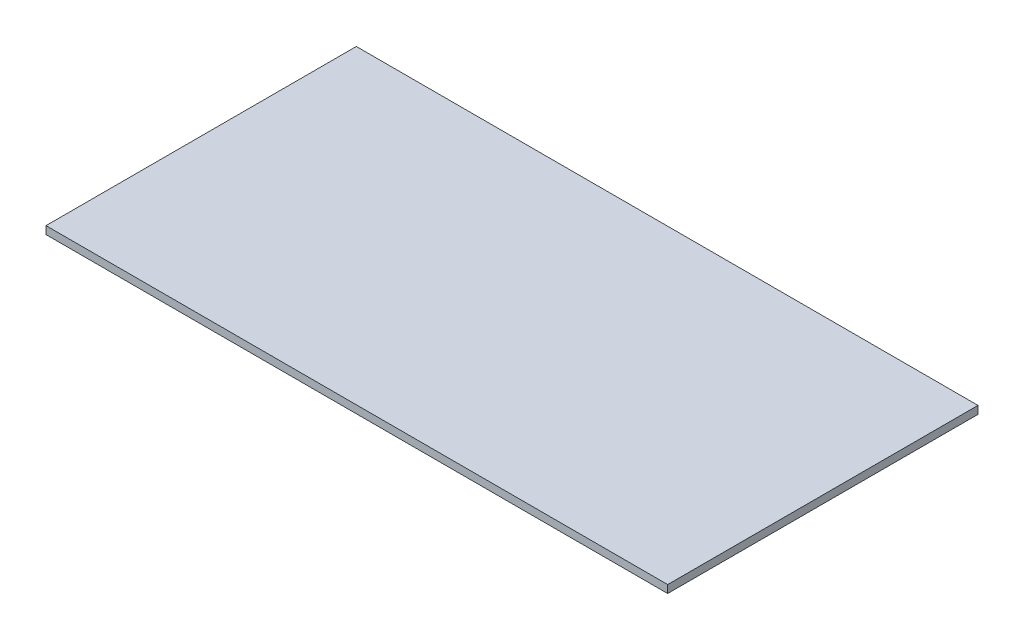
ISO-10303-21;
HEADER;
FILE_DESCRIPTION(('STEP AP214'),'2;1');
FILE_NAME('part.step','',(''),(''),'','','');
FILE_SCHEMA(('AUTOMOTIVE_DESIGN { 1 0 10303 214 1 1 1 1 }'));
ENDSEC;
DATA;
#1=APPLICATION_CONTEXT('core data for automotive mechanical design processes');
#2=APPLICATION_PROTOCOL_DEFINITION('international standard','automotive_design',2000,#1);
#3=PRODUCT_CONTEXT('',#1,'mechanical');
#4=PRODUCT('Part','Part','',(#3));
#5=PRODUCT_RELATED_PRODUCT_CATEGORY('part','',(#4));
#6=PRODUCT_DEFINITION_FORMATION('','',#4);
#7=PRODUCT_DEFINITION_CONTEXT('part definition',#1,'design');
#8=PRODUCT_DEFINITION('design','',#6,#7);
#9=PRODUCT_DEFINITION_SHAPE('','',#8);
#10=(LENGTH_UNIT() NAMED_UNIT(*) SI_UNIT(.MILLI.,.METRE.));
#11=(NAMED_UNIT(*) PLANE_ANGLE_UNIT() SI_UNIT($,.RADIAN.));
#12=(NAMED_UNIT(*) SI_UNIT($,.STERADIAN.) SOLID_ANGLE_UNIT());
#13=UNCERTAINTY_MEASURE_WITH_UNIT(LENGTH_MEASURE(1.E-05),#10,'distance_accuracy_value','');
#14=(GEOMETRIC_REPRESENTATION_CONTEXT(3) GLOBAL_UNCERTAINTY_ASSIGNED_CONTEXT((#13)) GLOBAL_UNIT_ASSIGNED_CONTEXT((#10,
#11,#12)) REPRESENTATION_CONTEXT('',''));
#15=CARTESIAN_POINT('',(0.,0.,0.));
#16=DIRECTION('',(0.,0.,1.));
#17=DIRECTION('',(1.,0.,0.));
#18=AXIS2_PLACEMENT_3D('',#15,#16,#17);
#19=CARTESIAN_POINT('',(1198.,30.,598.));
#20=DIRECTION('',(-1.,0.,0.));
#21=DIRECTION('',(0.,0.,1.));
#22=AXIS2_PLACEMENT_3D('',#19,#20,#21);
#23=PLANE('',#22);
#24=DIRECTION('',(0.,0.,-1.));
#25=VECTOR('',#24,1.);
#26=CARTESIAN_POINT('',(1198.,0.,598.));
#27=LINE('',#26,#25);
#28=CARTESIAN_POINT('',(1198.,0.,598.));
#29=VERTEX_POINT('',#28);
#30=CARTESIAN_POINT('',(1198.,0.,-598.));
#31=VERTEX_POINT('',#30);
#32=EDGE_CURVE('E96',#29,#31,#27,.T.);
#33=ORIENTED_EDGE('',*,*,#32,.T.);
#34=DIRECTION('',(0.,-1.,0.));
#35=VECTOR('',#34,1.);
#36=CARTESIAN_POINT('',(1198.,30.,-598.));
#37=LINE('',#36,#35);
#38=CARTESIAN_POINT('',(1198.,30.,-598.));
#39=VERTEX_POINT('',#38);
#40=EDGE_CURVE('E11',#39,#31,#37,.T.);
#41=ORIENTED_EDGE('',*,*,#40,.F.);
#42=DIRECTION('',(0.,0.,-1.));
#43=VECTOR('',#42,1.);
#44=CARTESIAN_POINT('',(1198.,30.,598.));
#45=LINE('',#44,#43);
#46=CARTESIAN_POINT('',(1198.,30.,598.));
#47=VERTEX_POINT('',#46);
#48=EDGE_CURVE('E84',#47,#39,#45,.T.);
#49=ORIENTED_EDGE('',*,*,#48,.F.);
#50=DIRECTION('',(0.,-1.,0.));
#51=VECTOR('',#50,1.);
#52=CARTESIAN_POINT('',(1198.,30.,598.));
#53=LINE('',#52,#51);
#54=EDGE_CURVE('E92',#47,#29,#53,.T.);
#55=ORIENTED_EDGE('',*,*,#54,.T.);
#56=EDGE_LOOP('',(#33,#41,#49,#55));
#57=FACE_BOUND('',#56,.T.);
#58=ADVANCED_FACE('F33',(#57),#23,.F.);
#59=CARTESIAN_POINT('',(-1198.,30.,-598.));
#60=DIRECTION('',(0.,0.,1.));
#61=DIRECTION('',(1.,0.,0.));
#62=AXIS2_PLACEMENT_3D('',#59,#60,#61);
#63=PLANE('',#62);
#64=DIRECTION('',(-1.,0.,0.));
#65=VECTOR('',#64,1.);
#66=CARTESIAN_POINT('',(-1198.,0.,-598.));
#67=LINE('',#66,#65);
#68=CARTESIAN_POINT('',(-1198.,0.,-598.));
#69=VERTEX_POINT('',#68);
#70=EDGE_CURVE('E88',#31,#69,#67,.T.);
#71=ORIENTED_EDGE('',*,*,#70,.T.);
#72=DIRECTION('',(0.,-1.,0.));
#73=VECTOR('',#72,1.);
#74=CARTESIAN_POINT('',(-1198.,30.,-598.));
#75=LINE('',#74,#73);
#76=CARTESIAN_POINT('',(-1198.,30.,-598.));
#77=VERTEX_POINT('',#76);
#78=EDGE_CURVE('E41',#77,#69,#75,.T.);
#79=ORIENTED_EDGE('',*,*,#78,.F.);
#80=DIRECTION('',(-1.,0.,0.));
#81=VECTOR('',#80,1.);
#82=CARTESIAN_POINT('',(-1198.,30.,-598.));
#83=LINE('',#82,#81);
#84=EDGE_CURVE('E79',#39,#77,#83,.T.);
#85=ORIENTED_EDGE('',*,*,#84,.F.);
#86=ORIENTED_EDGE('',*,*,#40,.T.);
#87=EDGE_LOOP('',(#71,#79,#85,#86));
#88=FACE_BOUND('',#87,.T.);
#89=ADVANCED_FACE('F87',(#88),#63,.F.);
#90=CARTESIAN_POINT('',(-1198.,30.,598.));
#91=DIRECTION('',(1.,0.,0.));
#92=DIRECTION('',(0.,0.,-1.));
#93=AXIS2_PLACEMENT_3D('',#90,#91,#92);
#94=PLANE('',#93);
#95=DIRECTION('',(0.,0.,1.));
#96=VECTOR('',#95,1.);
#97=CARTESIAN_POINT('',(-1198.,0.,598.));
#98=LINE('',#97,#96);
#99=CARTESIAN_POINT('',(-1198.,0.,598.));
#100=VERTEX_POINT('',#99);
#101=EDGE_CURVE('E66',#69,#100,#98,.T.);
#102=ORIENTED_EDGE('',*,*,#101,.T.);
#103=DIRECTION('',(0.,-1.,0.));
#104=VECTOR('',#103,1.);
#105=CARTESIAN_POINT('',(-1198.,30.,598.));
#106=LINE('',#105,#104);
#107=CARTESIAN_POINT('',(-1198.,30.,598.));
#108=VERTEX_POINT('',#107);
#109=EDGE_CURVE('E89',#108,#100,#106,.T.);
#110=ORIENTED_EDGE('',*,*,#109,.F.);
#111=DIRECTION('',(0.,0.,1.));
#112=VECTOR('',#111,1.);
#113=CARTESIAN_POINT('',(-1198.,30.,598.));
#114=LINE('',#113,#112);
#115=EDGE_CURVE('E82',#77,#108,#114,.T.);
#116=ORIENTED_EDGE('',*,*,#115,.F.);
#117=ORIENTED_EDGE('',*,*,#78,.T.);
#118=EDGE_LOOP('',(#102,#110,#116,#117));
#119=FACE_BOUND('',#118,.T.);
#120=ADVANCED_FACE('F90',(#119),#94,.F.);
#121=CARTESIAN_POINT('',(-1198.,30.,598.));
#122=DIRECTION('',(0.,0.,-1.));
#123=DIRECTION('',(-1.,0.,0.));
#124=AXIS2_PLACEMENT_3D('',#121,#122,#123);
#125=PLANE('',#124);
#126=DIRECTION('',(1.,0.,0.));
#127=VECTOR('',#126,1.);
#128=CARTESIAN_POINT('',(-1198.,0.,598.));
#129=LINE('',#128,#127);
#130=EDGE_CURVE('E72',#100,#29,#129,.T.);
#131=ORIENTED_EDGE('',*,*,#130,.T.);
#132=ORIENTED_EDGE('',*,*,#54,.F.);
#133=DIRECTION('',(1.,0.,0.));
#134=VECTOR('',#133,1.);
#135=CARTESIAN_POINT('',(-1198.,30.,598.));
#136=LINE('',#135,#134);
#137=EDGE_CURVE('E49',#108,#47,#136,.T.);
#138=ORIENTED_EDGE('',*,*,#137,.F.);
#139=ORIENTED_EDGE('',*,*,#109,.T.);
#140=EDGE_LOOP('',(#131,#132,#138,#139));
#141=FACE_BOUND('',#140,.T.);
#142=ADVANCED_FACE('F103',(#141),#125,.F.);
#143=CARTESIAN_POINT('',(0.,30.,0.));
#144=DIRECTION('',(0.,-1.,0.));
#145=DIRECTION('',(0.,0.,-1.));
#146=AXIS2_PLACEMENT_3D('',#143,#144,#145);
#147=PLANE('',#146);
#148=ORIENTED_EDGE('',*,*,#48,.T.);
#149=ORIENTED_EDGE('',*,*,#84,.T.);
#150=ORIENTED_EDGE('',*,*,#115,.T.);
#151=ORIENTED_EDGE('',*,*,#137,.T.);
#152=EDGE_LOOP('',(#148,#149,#150,#151));
#153=FACE_BOUND('',#152,.T.);
#154=ADVANCED_FACE('F80',(#153),#147,.F.);
#155=CARTESIAN_POINT('',(0.,0.,0.));
#156=DIRECTION('',(0.,-1.,0.));
#157=DIRECTION('',(0.,0.,-1.));
#158=AXIS2_PLACEMENT_3D('',#155,#156,#157);
#159=PLANE('',#158);
#160=ORIENTED_EDGE('',*,*,#32,.F.);
#161=ORIENTED_EDGE('',*,*,#130,.F.);
#162=ORIENTED_EDGE('',*,*,#101,.F.);
#163=ORIENTED_EDGE('',*,*,#70,.F.);
#164=EDGE_LOOP('',(#160,#161,#162,#163));
#165=FACE_BOUND('',#164,.T.);
#166=ADVANCED_FACE('F106',(#165),#159,.T.);
#167=CLOSED_SHELL('',(#58,#89,#120,#142,#154,#166));
#168=MANIFOLD_SOLID_BREP('B2',#167);
#169=ADVANCED_BREP_SHAPE_REPRESENTATION('',(#18,#168),#14);
#170=SHAPE_DEFINITION_REPRESENTATION(#9,#169);
ENDSEC;
END-ISO-10303-21;
